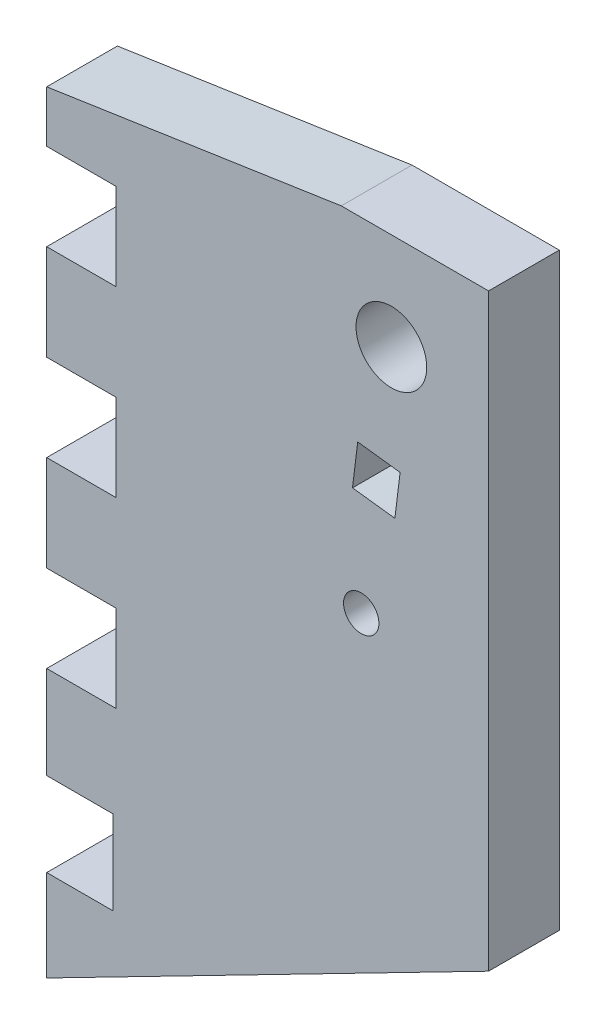
ISO-10303-21;
HEADER;
FILE_DESCRIPTION(('STEP AP214'),'2;1');
FILE_NAME('part.step','',(''),(''),'','','');
FILE_SCHEMA(('AUTOMOTIVE_DESIGN { 1 0 10303 214 1 1 1 1 }'));
ENDSEC;
DATA;
#1=APPLICATION_CONTEXT('core data for automotive mechanical design processes');
#2=APPLICATION_PROTOCOL_DEFINITION('international standard','automotive_design',2000,#1);
#3=PRODUCT_CONTEXT('',#1,'mechanical');
#4=PRODUCT('Part','Part','',(#3));
#5=PRODUCT_RELATED_PRODUCT_CATEGORY('part','',(#4));
#6=PRODUCT_DEFINITION_FORMATION('','',#4);
#7=PRODUCT_DEFINITION_CONTEXT('part definition',#1,'design');
#8=PRODUCT_DEFINITION('design','',#6,#7);
#9=PRODUCT_DEFINITION_SHAPE('','',#8);
#10=(LENGTH_UNIT() NAMED_UNIT(*) SI_UNIT(.MILLI.,.METRE.));
#11=(NAMED_UNIT(*) PLANE_ANGLE_UNIT() SI_UNIT($,.RADIAN.));
#12=(NAMED_UNIT(*) SI_UNIT($,.STERADIAN.) SOLID_ANGLE_UNIT());
#13=UNCERTAINTY_MEASURE_WITH_UNIT(LENGTH_MEASURE(1.E-05),#10,'distance_accuracy_value','');
#14=(GEOMETRIC_REPRESENTATION_CONTEXT(3) GLOBAL_UNCERTAINTY_ASSIGNED_CONTEXT((#13)) GLOBAL_UNIT_ASSIGNED_CONTEXT((#10,
#11,#12)) REPRESENTATION_CONTEXT('',''));
#15=CARTESIAN_POINT('',(0.,0.,0.));
#16=DIRECTION('',(0.,0.,1.));
#17=DIRECTION('',(1.,0.,0.));
#18=AXIS2_PLACEMENT_3D('',#15,#16,#17);
#19=CARTESIAN_POINT('',(-38.1,0.,6.096));
#20=DIRECTION('',(1.,0.,0.));
#21=DIRECTION('',(0.,0.,-1.));
#22=AXIS2_PLACEMENT_3D('',#19,#20,#21);
#23=PLANE('',#22);
#24=DIRECTION('',(0.,0.,1.));
#25=VECTOR('',#24,1.);
#26=CARTESIAN_POINT('',(-38.1,-62.484,0.));
#27=LINE('',#26,#25);
#28=CARTESIAN_POINT('',(-38.1,-62.484,0.));
#29=VERTEX_POINT('',#28);
#30=CARTESIAN_POINT('',(-38.1,-62.484,6.096));
#31=VERTEX_POINT('',#30);
#32=EDGE_CURVE('E264',#29,#31,#27,.T.);
#33=ORIENTED_EDGE('',*,*,#32,.F.);
#34=DIRECTION('',(0.,-1.,0.));
#35=VECTOR('',#34,1.);
#36=CARTESIAN_POINT('',(-38.1,0.,0.));
#37=LINE('',#36,#35);
#38=CARTESIAN_POINT('',(-38.1,-70.358,0.));
#39=VERTEX_POINT('',#38);
#40=EDGE_CURVE('E325',#29,#39,#37,.T.);
#41=ORIENTED_EDGE('',*,*,#40,.T.);
#42=DIRECTION('',(0.,0.,-1.));
#43=VECTOR('',#42,1.);
#44=CARTESIAN_POINT('',(-38.1,-70.358,6.096));
#45=LINE('',#44,#43);
#46=CARTESIAN_POINT('',(-38.1,-70.358,6.096));
#47=VERTEX_POINT('',#46);
#48=EDGE_CURVE('E11',#47,#39,#45,.T.);
#49=ORIENTED_EDGE('',*,*,#48,.F.);
#50=DIRECTION('',(0.,-1.,0.));
#51=VECTOR('',#50,1.);
#52=CARTESIAN_POINT('',(-38.1,0.,6.096));
#53=LINE('',#52,#51);
#54=EDGE_CURVE('E285',#31,#47,#53,.T.);
#55=ORIENTED_EDGE('',*,*,#54,.F.);
#56=EDGE_LOOP('',(#33,#41,#49,#55));
#57=FACE_BOUND('',#56,.T.);
#58=ADVANCED_FACE('F41',(#57),#23,.F.);
#59=DIRECTION('',(0.,0.,1.));
#60=VECTOR('',#59,1.);
#61=CARTESIAN_POINT('',(-38.1,-55.245,0.));
#62=LINE('',#61,#60);
#63=CARTESIAN_POINT('',(-38.1,-55.245,0.));
#64=VERTEX_POINT('',#63);
#65=CARTESIAN_POINT('',(-38.1,-55.245,6.096));
#66=VERTEX_POINT('',#65);
#67=EDGE_CURVE('E267',#64,#66,#62,.T.);
#68=ORIENTED_EDGE('',*,*,#67,.T.);
#69=CARTESIAN_POINT('',(-38.1,-47.244,6.096));
#70=VERTEX_POINT('',#69);
#71=EDGE_CURVE('E287',#70,#66,#53,.T.);
#72=ORIENTED_EDGE('',*,*,#71,.F.);
#73=DIRECTION('',(0.,0.,-1.));
#74=VECTOR('',#73,1.);
#75=CARTESIAN_POINT('',(-38.1,-47.244,6.096));
#76=LINE('',#75,#74);
#77=CARTESIAN_POINT('',(-38.1,-47.244,0.));
#78=VERTEX_POINT('',#77);
#79=EDGE_CURVE('E322',#70,#78,#76,.T.);
#80=ORIENTED_EDGE('',*,*,#79,.T.);
#81=EDGE_CURVE('E326',#78,#64,#37,.T.);
#82=ORIENTED_EDGE('',*,*,#81,.T.);
#83=EDGE_LOOP('',(#68,#72,#80,#82));
#84=FACE_BOUND('',#83,.T.);
#85=ADVANCED_FACE('F437',(#84),#23,.F.);
#86=CARTESIAN_POINT('',(0.,0.,6.096));
#87=DIRECTION('',(0.,0.,1.));
#88=DIRECTION('',(1.,0.,0.));
#89=AXIS2_PLACEMENT_3D('',#86,#87,#88);
#90=PLANE('',#89);
#91=CARTESIAN_POINT('',(-10.9822043108922,-29.5589646914192,6.096));
#92=DIRECTION('',(0.,0.,1.));
#93=DIRECTION('',(1.,0.,0.));
#94=AXIS2_PLACEMENT_3D('',#91,#92,#93);
#95=CIRCLE('',#94,1.524);
#96=CARTESIAN_POINT('',(-9.45820431089224,-29.5589646914192,6.096));
#97=VERTEX_POINT('',#96);
#98=EDGE_CURVE('E259',#97,#97,#95,.F.);
#99=ORIENTED_EDGE('',*,*,#98,.T.);
#100=EDGE_LOOP('',(#99));
#101=FACE_BOUND('',#100,.T.);
#102=DIRECTION('',(-0.992546151641322,0.121869343405148,0.));
#103=VECTOR('',#102,1.);
#104=CARTESIAN_POINT('',(-8.07875081307921,-21.0226784798377,6.096));
#105=LINE('',#104,#103);
#106=CARTESIAN_POINT('',(-8.07875081307921,-21.0226784798377,6.096));
#107=VERTEX_POINT('',#106);
#108=CARTESIAN_POINT('',(-11.7342982895742,-20.5738336880765,6.096));
#109=VERTEX_POINT('',#108);
#110=EDGE_CURVE('E222',#107,#109,#105,.T.);
#111=ORIENTED_EDGE('',*,*,#110,.T.);
#112=DIRECTION('',(0.121869343405149,0.992546151641322,0.));
#113=VECTOR('',#112,1.);
#114=CARTESIAN_POINT('',(-11.285453497813,-16.9182862115815,6.096));
#115=LINE('',#114,#113);
#116=CARTESIAN_POINT('',(-11.285453497813,-16.9182862115815,6.096));
#117=VERTEX_POINT('',#116);
#118=EDGE_CURVE('E209',#109,#117,#115,.T.);
#119=ORIENTED_EDGE('',*,*,#118,.T.);
#120=DIRECTION('',(0.992546151641322,-0.121869343405148,0.));
#121=VECTOR('',#120,1.);
#122=CARTESIAN_POINT('',(-7.62990602131805,-17.3671310033427,6.096));
#123=LINE('',#122,#121);
#124=CARTESIAN_POINT('',(-7.62990602131805,-17.3671310033427,6.096));
#125=VERTEX_POINT('',#124);
#126=EDGE_CURVE('E240',#117,#125,#123,.T.);
#127=ORIENTED_EDGE('',*,*,#126,.T.);
#128=DIRECTION('',(-0.121869343405148,-0.992546151641322,0.));
#129=VECTOR('',#128,1.);
#130=CARTESIAN_POINT('',(-7.62990602131805,-17.3671310033427,6.096));
#131=LINE('',#130,#129);
#132=EDGE_CURVE('E230',#125,#107,#131,.T.);
#133=ORIENTED_EDGE('',*,*,#132,.T.);
#134=EDGE_LOOP('',(#111,#119,#127,#133));
#135=FACE_BOUND('',#134,.T.);
#136=CARTESIAN_POINT('',(-8.382,-8.382,6.096));
#137=DIRECTION('',(0.,0.,1.));
#138=DIRECTION('',(1.,0.,0.));
#139=AXIS2_PLACEMENT_3D('',#136,#137,#138);
#140=CIRCLE('',#139,3.048);
#141=CARTESIAN_POINT('',(-11.43,-8.382,6.096));
#142=VERTEX_POINT('',#141);
#143=EDGE_CURVE('E282',#142,#142,#140,.T.);
#144=ORIENTED_EDGE('',*,*,#143,.F.);
#145=EDGE_LOOP('',(#144));
#146=FACE_BOUND('',#145,.T.);
#147=DIRECTION('',(0.,-1.,0.));
#148=VECTOR('',#147,1.);
#149=CARTESIAN_POINT('',(-32.385,0.,6.096));
#150=LINE('',#149,#148);
#151=CARTESIAN_POINT('',(-32.385,-55.245,6.096));
#152=VERTEX_POINT('',#151);
#153=CARTESIAN_POINT('',(-32.385,-62.484,6.096));
#154=VERTEX_POINT('',#153);
#155=EDGE_CURVE('E258',#152,#154,#150,.T.);
#156=ORIENTED_EDGE('',*,*,#155,.T.);
#157=DIRECTION('',(-1.,0.,0.));
#158=VECTOR('',#157,1.);
#159=CARTESIAN_POINT('',(0.,-62.484,6.096));
#160=LINE('',#159,#158);
#161=EDGE_CURVE('E255',#154,#31,#160,.T.);
#162=ORIENTED_EDGE('',*,*,#161,.T.);
#163=ORIENTED_EDGE('',*,*,#54,.T.);
#164=DIRECTION('',(0.889632145943001,0.456677834917407,0.));
#165=VECTOR('',#164,1.);
#166=CARTESIAN_POINT('',(20.6387843399346,-40.2054240388336,6.096));
#167=LINE('',#166,#165);
#168=CARTESIAN_POINT('',(0.,-50.8,6.096));
#169=VERTEX_POINT('',#168);
#170=EDGE_CURVE('E290',#47,#169,#167,.T.);
#171=ORIENTED_EDGE('',*,*,#170,.T.);
#172=DIRECTION('',(0.,-1.,0.));
#173=VECTOR('',#172,1.);
#174=CARTESIAN_POINT('',(0.,0.,6.096));
#175=LINE('',#174,#173);
#176=CARTESIAN_POINT('',(0.,0.,6.096));
#177=VERTEX_POINT('',#176);
#178=EDGE_CURVE('E292',#177,#169,#175,.T.);
#179=ORIENTED_EDGE('',*,*,#178,.F.);
#180=DIRECTION('',(-1.,0.,0.));
#181=VECTOR('',#180,1.);
#182=CARTESIAN_POINT('',(0.,0.,6.096));
#183=LINE('',#182,#181);
#184=CARTESIAN_POINT('',(-12.7,0.,6.096));
#185=VERTEX_POINT('',#184);
#186=EDGE_CURVE('E295',#177,#185,#183,.T.);
#187=ORIENTED_EDGE('',*,*,#186,.T.);
#188=DIRECTION('',(0.988936352868298,0.148340452930245,0.));
#189=VECTOR('',#188,1.);
#190=CARTESIAN_POINT('',(-0.279462102689486,1.86308068459657,6.096));
#191=LINE('',#190,#189);
#192=CARTESIAN_POINT('',(-38.1,-3.81,6.096));
#193=VERTEX_POINT('',#192);
#194=EDGE_CURVE('E278',#193,#185,#191,.T.);
#195=ORIENTED_EDGE('',*,*,#194,.F.);
#196=DIRECTION('',(0.,-1.,0.));
#197=VECTOR('',#196,1.);
#198=CARTESIAN_POINT('',(-38.1,0.,6.096));
#199=LINE('',#198,#197);
#200=CARTESIAN_POINT('',(-38.1,-8.25500000000001,6.096));
#201=VERTEX_POINT('',#200);
#202=EDGE_CURVE('E298',#193,#201,#199,.T.);
#203=ORIENTED_EDGE('',*,*,#202,.T.);
#204=DIRECTION('',(1.,0.,0.));
#205=VECTOR('',#204,1.);
#206=CARTESIAN_POINT('',(0.,-8.25500000000001,6.096));
#207=LINE('',#206,#205);
#208=CARTESIAN_POINT('',(-32.131,-8.25500000000001,6.096));
#209=VERTEX_POINT('',#208);
#210=EDGE_CURVE('E300',#201,#209,#207,.T.);
#211=ORIENTED_EDGE('',*,*,#210,.T.);
#212=DIRECTION('',(0.,-1.,0.));
#213=VECTOR('',#212,1.);
#214=CARTESIAN_POINT('',(-32.131,0.,6.096));
#215=LINE('',#214,#213);
#216=CARTESIAN_POINT('',(-32.131,-15.748,6.096));
#217=VERTEX_POINT('',#216);
#218=EDGE_CURVE('E302',#209,#217,#215,.T.);
#219=ORIENTED_EDGE('',*,*,#218,.T.);
#220=DIRECTION('',(-1.,0.,0.));
#221=VECTOR('',#220,1.);
#222=CARTESIAN_POINT('',(0.,-15.748,6.096));
#223=LINE('',#222,#221);
#224=CARTESIAN_POINT('',(-38.1,-15.748,6.096));
#225=VERTEX_POINT('',#224);
#226=EDGE_CURVE('E304',#217,#225,#223,.T.);
#227=ORIENTED_EDGE('',*,*,#226,.T.);
#228=DIRECTION('',(0.,-1.,0.));
#229=VECTOR('',#228,1.);
#230=CARTESIAN_POINT('',(-38.1,0.,6.096));
#231=LINE('',#230,#229);
#232=CARTESIAN_POINT('',(-38.1,-24.003,6.096));
#233=VERTEX_POINT('',#232);
#234=EDGE_CURVE('E306',#225,#233,#231,.T.);
#235=ORIENTED_EDGE('',*,*,#234,.T.);
#236=DIRECTION('',(1.,0.,0.));
#237=VECTOR('',#236,1.);
#238=CARTESIAN_POINT('',(0.,-24.003,6.096));
#239=LINE('',#238,#237);
#240=CARTESIAN_POINT('',(-32.131,-24.003,6.096));
#241=VERTEX_POINT('',#240);
#242=EDGE_CURVE('E308',#233,#241,#239,.T.);
#243=ORIENTED_EDGE('',*,*,#242,.T.);
#244=DIRECTION('',(0.,-1.,0.));
#245=VECTOR('',#244,1.);
#246=CARTESIAN_POINT('',(-32.131,0.,6.096));
#247=LINE('',#246,#245);
#248=CARTESIAN_POINT('',(-32.131,-31.496,6.096));
#249=VERTEX_POINT('',#248);
#250=EDGE_CURVE('E310',#241,#249,#247,.T.);
#251=ORIENTED_EDGE('',*,*,#250,.T.);
#252=DIRECTION('',(-1.,0.,0.));
#253=VECTOR('',#252,1.);
#254=CARTESIAN_POINT('',(0.,-31.496,6.096));
#255=LINE('',#254,#253);
#256=CARTESIAN_POINT('',(-38.1,-31.496,6.096));
#257=VERTEX_POINT('',#256);
#258=EDGE_CURVE('E312',#249,#257,#255,.T.);
#259=ORIENTED_EDGE('',*,*,#258,.T.);
#260=DIRECTION('',(0.,-1.,0.));
#261=VECTOR('',#260,1.);
#262=CARTESIAN_POINT('',(-38.1,0.,6.096));
#263=LINE('',#262,#261);
#264=CARTESIAN_POINT('',(-38.1,-39.751,6.096));
#265=VERTEX_POINT('',#264);
#266=EDGE_CURVE('E314',#257,#265,#263,.T.);
#267=ORIENTED_EDGE('',*,*,#266,.T.);
#268=DIRECTION('',(1.,0.,0.));
#269=VECTOR('',#268,1.);
#270=CARTESIAN_POINT('',(0.,-39.751,6.096));
#271=LINE('',#270,#269);
#272=CARTESIAN_POINT('',(-32.131,-39.751,6.096));
#273=VERTEX_POINT('',#272);
#274=EDGE_CURVE('E316',#265,#273,#271,.T.);
#275=ORIENTED_EDGE('',*,*,#274,.T.);
#276=DIRECTION('',(0.,-1.,0.));
#277=VECTOR('',#276,1.);
#278=CARTESIAN_POINT('',(-32.131,0.,6.096));
#279=LINE('',#278,#277);
#280=CARTESIAN_POINT('',(-32.131,-47.244,6.096));
#281=VERTEX_POINT('',#280);
#282=EDGE_CURVE('E318',#273,#281,#279,.T.);
#283=ORIENTED_EDGE('',*,*,#282,.T.);
#284=DIRECTION('',(-1.,0.,0.));
#285=VECTOR('',#284,1.);
#286=CARTESIAN_POINT('',(0.,-47.244,6.096));
#287=LINE('',#286,#285);
#288=EDGE_CURVE('E320',#281,#70,#287,.T.);
#289=ORIENTED_EDGE('',*,*,#288,.T.);
#290=ORIENTED_EDGE('',*,*,#71,.T.);
#291=DIRECTION('',(1.,0.,0.));
#292=VECTOR('',#291,1.);
#293=CARTESIAN_POINT('',(0.,-55.245,6.096));
#294=LINE('',#293,#292);
#295=EDGE_CURVE('E249',#66,#152,#294,.T.);
#296=ORIENTED_EDGE('',*,*,#295,.T.);
#297=EDGE_LOOP('',(#156,#162,#163,#171,#179,#187,#195,#203,#211,#219,#227,#235,#243,#251,#259,
#267,#275,#283,#289,#290,#296));
#298=FACE_BOUND('',#297,.T.);
#299=ADVANCED_FACE('F228',(#101,#135,#146,#298),#90,.T.);
#300=CARTESIAN_POINT('',(0.,0.,0.));
#301=DIRECTION('',(0.,0.,1.));
#302=DIRECTION('',(1.,0.,0.));
#303=AXIS2_PLACEMENT_3D('',#300,#301,#302);
#304=PLANE('',#303);
#305=CARTESIAN_POINT('',(-10.9822043108922,-29.5589646914192,0.));
#306=DIRECTION('',(0.,0.,-1.));
#307=DIRECTION('',(-1.,0.,0.));
#308=AXIS2_PLACEMENT_3D('',#305,#306,#307);
#309=CIRCLE('',#308,1.524);
#310=CARTESIAN_POINT('',(-12.5062043108922,-29.5589646914192,0.));
#311=VERTEX_POINT('',#310);
#312=EDGE_CURVE('E245',#311,#311,#309,.T.);
#313=ORIENTED_EDGE('',*,*,#312,.F.);
#314=EDGE_LOOP('',(#313));
#315=FACE_BOUND('',#314,.T.);
#316=DIRECTION('',(0.121869343405149,0.992546151641322,0.));
#317=VECTOR('',#316,1.);
#318=CARTESIAN_POINT('',(-11.285453497813,-16.9182862115815,0.));
#319=LINE('',#318,#317);
#320=CARTESIAN_POINT('',(-11.7342982895742,-20.5738336880765,0.));
#321=VERTEX_POINT('',#320);
#322=CARTESIAN_POINT('',(-11.285453497813,-16.9182862115815,0.));
#323=VERTEX_POINT('',#322);
#324=EDGE_CURVE('E232',#321,#323,#319,.T.);
#325=ORIENTED_EDGE('',*,*,#324,.F.);
#326=DIRECTION('',(-0.992546151641322,0.121869343405148,0.));
#327=VECTOR('',#326,1.);
#328=CARTESIAN_POINT('',(-8.07875081307921,-21.0226784798377,0.));
#329=LINE('',#328,#327);
#330=CARTESIAN_POINT('',(-8.07875081307921,-21.0226784798377,0.));
#331=VERTEX_POINT('',#330);
#332=EDGE_CURVE('E225',#331,#321,#329,.T.);
#333=ORIENTED_EDGE('',*,*,#332,.F.);
#334=DIRECTION('',(-0.121869343405148,-0.992546151641322,0.));
#335=VECTOR('',#334,1.);
#336=CARTESIAN_POINT('',(-7.62990602131805,-17.3671310033427,0.));
#337=LINE('',#336,#335);
#338=CARTESIAN_POINT('',(-7.62990602131805,-17.3671310033427,0.));
#339=VERTEX_POINT('',#338);
#340=EDGE_CURVE('E236',#339,#331,#337,.T.);
#341=ORIENTED_EDGE('',*,*,#340,.F.);
#342=DIRECTION('',(0.992546151641322,-0.121869343405148,0.));
#343=VECTOR('',#342,1.);
#344=CARTESIAN_POINT('',(-7.62990602131805,-17.3671310033427,0.));
#345=LINE('',#344,#343);
#346=EDGE_CURVE('E64',#323,#339,#345,.T.);
#347=ORIENTED_EDGE('',*,*,#346,.F.);
#348=EDGE_LOOP('',(#325,#333,#341,#347));
#349=FACE_BOUND('',#348,.T.);
#350=CARTESIAN_POINT('',(-8.382,-8.382,0.));
#351=DIRECTION('',(0.,0.,1.));
#352=DIRECTION('',(1.,0.,0.));
#353=AXIS2_PLACEMENT_3D('',#350,#351,#352);
#354=CIRCLE('',#353,3.048);
#355=CARTESIAN_POINT('',(-11.43,-8.382,0.));
#356=VERTEX_POINT('',#355);
#357=EDGE_CURVE('E281',#356,#356,#354,.T.);
#358=ORIENTED_EDGE('',*,*,#357,.T.);
#359=EDGE_LOOP('',(#358));
#360=FACE_BOUND('',#359,.T.);
#361=DIRECTION('',(-1.,0.,0.));
#362=VECTOR('',#361,1.);
#363=CARTESIAN_POINT('',(0.,-62.484,0.));
#364=LINE('',#363,#362);
#365=CARTESIAN_POINT('',(-32.385,-62.484,0.));
#366=VERTEX_POINT('',#365);
#367=EDGE_CURVE('E246',#366,#29,#364,.T.);
#368=ORIENTED_EDGE('',*,*,#367,.F.);
#369=DIRECTION('',(0.,-1.,0.));
#370=VECTOR('',#369,1.);
#371=CARTESIAN_POINT('',(-32.385,0.,0.));
#372=LINE('',#371,#370);
#373=CARTESIAN_POINT('',(-32.385,-55.245,0.));
#374=VERTEX_POINT('',#373);
#375=EDGE_CURVE('E248',#374,#366,#372,.T.);
#376=ORIENTED_EDGE('',*,*,#375,.F.);
#377=DIRECTION('',(1.,0.,0.));
#378=VECTOR('',#377,1.);
#379=CARTESIAN_POINT('',(0.,-55.245,0.));
#380=LINE('',#379,#378);
#381=EDGE_CURVE('E251',#64,#374,#380,.T.);
#382=ORIENTED_EDGE('',*,*,#381,.F.);
#383=ORIENTED_EDGE('',*,*,#81,.F.);
#384=DIRECTION('',(-1.,0.,0.));
#385=VECTOR('',#384,1.);
#386=CARTESIAN_POINT('',(0.,-47.244,0.));
#387=LINE('',#386,#385);
#388=CARTESIAN_POINT('',(-32.131,-47.244,0.));
#389=VERTEX_POINT('',#388);
#390=EDGE_CURVE('E286',#389,#78,#387,.T.);
#391=ORIENTED_EDGE('',*,*,#390,.F.);
#392=DIRECTION('',(0.,-1.,0.));
#393=VECTOR('',#392,1.);
#394=CARTESIAN_POINT('',(-32.131,0.,0.));
#395=LINE('',#394,#393);
#396=CARTESIAN_POINT('',(-32.131,-39.751,0.));
#397=VERTEX_POINT('',#396);
#398=EDGE_CURVE('E358',#397,#389,#395,.T.);
#399=ORIENTED_EDGE('',*,*,#398,.F.);
#400=DIRECTION('',(1.,0.,0.));
#401=VECTOR('',#400,1.);
#402=CARTESIAN_POINT('',(0.,-39.751,0.));
#403=LINE('',#402,#401);
#404=CARTESIAN_POINT('',(-38.1,-39.751,0.));
#405=VERTEX_POINT('',#404);
#406=EDGE_CURVE('E356',#405,#397,#403,.T.);
#407=ORIENTED_EDGE('',*,*,#406,.F.);
#408=DIRECTION('',(0.,-1.,0.));
#409=VECTOR('',#408,1.);
#410=CARTESIAN_POINT('',(-38.1,0.,0.));
#411=LINE('',#410,#409);
#412=CARTESIAN_POINT('',(-38.1,-31.496,0.));
#413=VERTEX_POINT('',#412);
#414=EDGE_CURVE('E354',#413,#405,#411,.T.);
#415=ORIENTED_EDGE('',*,*,#414,.F.);
#416=DIRECTION('',(-1.,0.,0.));
#417=VECTOR('',#416,1.);
#418=CARTESIAN_POINT('',(0.,-31.496,0.));
#419=LINE('',#418,#417);
#420=CARTESIAN_POINT('',(-32.131,-31.496,0.));
#421=VERTEX_POINT('',#420);
#422=EDGE_CURVE('E352',#421,#413,#419,.T.);
#423=ORIENTED_EDGE('',*,*,#422,.F.);
#424=DIRECTION('',(0.,-1.,0.));
#425=VECTOR('',#424,1.);
#426=CARTESIAN_POINT('',(-32.131,0.,0.));
#427=LINE('',#426,#425);
#428=CARTESIAN_POINT('',(-32.131,-24.003,0.));
#429=VERTEX_POINT('',#428);
#430=EDGE_CURVE('E350',#429,#421,#427,.T.);
#431=ORIENTED_EDGE('',*,*,#430,.F.);
#432=DIRECTION('',(1.,0.,0.));
#433=VECTOR('',#432,1.);
#434=CARTESIAN_POINT('',(0.,-24.003,0.));
#435=LINE('',#434,#433);
#436=CARTESIAN_POINT('',(-38.1,-24.003,0.));
#437=VERTEX_POINT('',#436);
#438=EDGE_CURVE('E348',#437,#429,#435,.T.);
#439=ORIENTED_EDGE('',*,*,#438,.F.);
#440=DIRECTION('',(0.,-1.,0.));
#441=VECTOR('',#440,1.);
#442=CARTESIAN_POINT('',(-38.1,0.,0.));
#443=LINE('',#442,#441);
#444=CARTESIAN_POINT('',(-38.1,-15.748,0.));
#445=VERTEX_POINT('',#444);
#446=EDGE_CURVE('E346',#445,#437,#443,.T.);
#447=ORIENTED_EDGE('',*,*,#446,.F.);
#448=DIRECTION('',(-1.,0.,0.));
#449=VECTOR('',#448,1.);
#450=CARTESIAN_POINT('',(0.,-15.748,0.));
#451=LINE('',#450,#449);
#452=CARTESIAN_POINT('',(-32.131,-15.748,0.));
#453=VERTEX_POINT('',#452);
#454=EDGE_CURVE('E344',#453,#445,#451,.T.);
#455=ORIENTED_EDGE('',*,*,#454,.F.);
#456=DIRECTION('',(0.,-1.,0.));
#457=VECTOR('',#456,1.);
#458=CARTESIAN_POINT('',(-32.131,0.,0.));
#459=LINE('',#458,#457);
#460=CARTESIAN_POINT('',(-32.131,-8.25500000000001,0.));
#461=VERTEX_POINT('',#460);
#462=EDGE_CURVE('E342',#461,#453,#459,.T.);
#463=ORIENTED_EDGE('',*,*,#462,.F.);
#464=DIRECTION('',(1.,0.,0.));
#465=VECTOR('',#464,1.);
#466=CARTESIAN_POINT('',(0.,-8.25500000000001,0.));
#467=LINE('',#466,#465);
#468=CARTESIAN_POINT('',(-38.1,-8.25500000000001,0.));
#469=VERTEX_POINT('',#468);
#470=EDGE_CURVE('E340',#469,#461,#467,.T.);
#471=ORIENTED_EDGE('',*,*,#470,.F.);
#472=DIRECTION('',(0.,-1.,0.));
#473=VECTOR('',#472,1.);
#474=CARTESIAN_POINT('',(-38.1,0.,0.));
#475=LINE('',#474,#473);
#476=CARTESIAN_POINT('',(-38.1,-3.81,0.));
#477=VERTEX_POINT('',#476);
#478=EDGE_CURVE('E338',#477,#469,#475,.T.);
#479=ORIENTED_EDGE('',*,*,#478,.F.);
#480=DIRECTION('',(-0.988936352868298,-0.148340452930245,0.));
#481=VECTOR('',#480,1.);
#482=CARTESIAN_POINT('',(-12.7,0.,0.));
#483=LINE('',#482,#481);
#484=CARTESIAN_POINT('',(-12.7,0.,0.));
#485=VERTEX_POINT('',#484);
#486=EDGE_CURVE('E266',#485,#477,#483,.T.);
#487=ORIENTED_EDGE('',*,*,#486,.F.);
#488=DIRECTION('',(-1.,0.,0.));
#489=VECTOR('',#488,1.);
#490=CARTESIAN_POINT('',(0.,0.,0.));
#491=LINE('',#490,#489);
#492=CARTESIAN_POINT('',(0.,0.,0.));
#493=VERTEX_POINT('',#492);
#494=EDGE_CURVE('E335',#493,#485,#491,.T.);
#495=ORIENTED_EDGE('',*,*,#494,.F.);
#496=DIRECTION('',(0.,-1.,0.));
#497=VECTOR('',#496,1.);
#498=CARTESIAN_POINT('',(0.,0.,0.));
#499=LINE('',#498,#497);
#500=CARTESIAN_POINT('',(0.,-50.8,0.));
#501=VERTEX_POINT('',#500);
#502=EDGE_CURVE('E332',#493,#501,#499,.T.);
#503=ORIENTED_EDGE('',*,*,#502,.T.);
#504=DIRECTION('',(0.889632145943001,0.456677834917407,0.));
#505=VECTOR('',#504,1.);
#506=CARTESIAN_POINT('',(20.6387843399346,-40.2054240388336,0.));
#507=LINE('',#506,#505);
#508=EDGE_CURVE('E329',#39,#501,#507,.T.);
#509=ORIENTED_EDGE('',*,*,#508,.F.);
#510=ORIENTED_EDGE('',*,*,#40,.F.);
#511=EDGE_LOOP('',(#368,#376,#382,#383,#391,#399,#407,#415,#423,#431,#439,#447,#455,#463,#471,
#479,#487,#495,#503,#509,#510));
#512=FACE_BOUND('',#511,.T.);
#513=ADVANCED_FACE('F411',(#315,#349,#360,#512),#304,.F.);
#514=CARTESIAN_POINT('',(20.6387843399346,-40.2054240388336,6.096));
#515=DIRECTION('',(-0.456677834917407,0.889632145943001,0.));
#516=DIRECTION('',(-0.889632145943001,-0.456677834917407,0.));
#517=AXIS2_PLACEMENT_3D('',#514,#515,#516);
#518=PLANE('',#517);
#519=ORIENTED_EDGE('',*,*,#508,.T.);
#520=DIRECTION('',(0.,0.,-1.));
#521=VECTOR('',#520,1.);
#522=CARTESIAN_POINT('',(0.,-50.8,6.096));
#523=LINE('',#522,#521);
#524=EDGE_CURVE('E49',#169,#501,#523,.T.);
#525=ORIENTED_EDGE('',*,*,#524,.F.);
#526=ORIENTED_EDGE('',*,*,#170,.F.);
#527=ORIENTED_EDGE('',*,*,#48,.T.);
#528=EDGE_LOOP('',(#519,#525,#526,#527));
#529=FACE_BOUND('',#528,.T.);
#530=ADVANCED_FACE('F405',(#529),#518,.F.);
#531=CARTESIAN_POINT('',(0.,0.,6.096));
#532=DIRECTION('',(1.,0.,0.));
#533=DIRECTION('',(0.,1.,0.));
#534=AXIS2_PLACEMENT_3D('',#531,#532,#533);
#535=PLANE('',#534);
#536=ORIENTED_EDGE('',*,*,#502,.F.);
#537=DIRECTION('',(0.,0.,-1.));
#538=VECTOR('',#537,1.);
#539=CARTESIAN_POINT('',(0.,0.,6.096));
#540=LINE('',#539,#538);
#541=EDGE_CURVE('E396',#177,#493,#540,.T.);
#542=ORIENTED_EDGE('',*,*,#541,.F.);
#543=ORIENTED_EDGE('',*,*,#178,.T.);
#544=ORIENTED_EDGE('',*,*,#524,.T.);
#545=EDGE_LOOP('',(#536,#542,#543,#544));
#546=FACE_BOUND('',#545,.T.);
#547=ADVANCED_FACE('F400',(#546),#535,.T.);
#548=CARTESIAN_POINT('',(0.,0.,6.096));
#549=DIRECTION('',(0.,-1.,0.));
#550=DIRECTION('',(0.,0.,-1.));
#551=AXIS2_PLACEMENT_3D('',#548,#549,#550);
#552=PLANE('',#551);
#553=ORIENTED_EDGE('',*,*,#494,.T.);
#554=DIRECTION('',(0.,0.,-1.));
#555=VECTOR('',#554,1.);
#556=CARTESIAN_POINT('',(-12.7,0.,8.636));
#557=LINE('',#556,#555);
#558=EDGE_CURVE('E274',#185,#485,#557,.T.);
#559=ORIENTED_EDGE('',*,*,#558,.F.);
#560=ORIENTED_EDGE('',*,*,#186,.F.);
#561=ORIENTED_EDGE('',*,*,#541,.T.);
#562=EDGE_LOOP('',(#553,#559,#560,#561));
#563=FACE_BOUND('',#562,.T.);
#564=ADVANCED_FACE('F416',(#563),#552,.F.);
#565=CARTESIAN_POINT('',(-38.1,0.,6.096));
#566=DIRECTION('',(1.,0.,0.));
#567=DIRECTION('',(0.,0.,-1.));
#568=AXIS2_PLACEMENT_3D('',#565,#566,#567);
#569=PLANE('',#568);
#570=ORIENTED_EDGE('',*,*,#202,.F.);
#571=DIRECTION('',(0.,0.,-1.));
#572=VECTOR('',#571,1.);
#573=CARTESIAN_POINT('',(-38.1,-3.81,8.636));
#574=LINE('',#573,#572);
#575=EDGE_CURVE('E275',#193,#477,#574,.T.);
#576=ORIENTED_EDGE('',*,*,#575,.T.);
#577=ORIENTED_EDGE('',*,*,#478,.T.);
#578=DIRECTION('',(0.,0.,-1.));
#579=VECTOR('',#578,1.);
#580=CARTESIAN_POINT('',(-38.1,-8.25500000000001,6.096));
#581=LINE('',#580,#579);
#582=EDGE_CURVE('E393',#201,#469,#581,.T.);
#583=ORIENTED_EDGE('',*,*,#582,.F.);
#584=EDGE_LOOP('',(#570,#576,#577,#583));
#585=FACE_BOUND('',#584,.T.);
#586=ADVANCED_FACE('F496',(#585),#569,.F.);
#587=CARTESIAN_POINT('',(0.,-8.25500000000001,6.096));
#588=DIRECTION('',(0.,1.,0.));
#589=DIRECTION('',(0.,0.,1.));
#590=AXIS2_PLACEMENT_3D('',#587,#588,#589);
#591=PLANE('',#590);
#592=ORIENTED_EDGE('',*,*,#470,.T.);
#593=DIRECTION('',(0.,0.,-1.));
#594=VECTOR('',#593,1.);
#595=CARTESIAN_POINT('',(-32.131,-8.25500000000001,6.096));
#596=LINE('',#595,#594);
#597=EDGE_CURVE('E390',#209,#461,#596,.T.);
#598=ORIENTED_EDGE('',*,*,#597,.F.);
#599=ORIENTED_EDGE('',*,*,#210,.F.);
#600=ORIENTED_EDGE('',*,*,#582,.T.);
#601=EDGE_LOOP('',(#592,#598,#599,#600));
#602=FACE_BOUND('',#601,.T.);
#603=ADVANCED_FACE('F491',(#602),#591,.F.);
#604=CARTESIAN_POINT('',(-32.131,0.,6.096));
#605=DIRECTION('',(1.,0.,0.));
#606=DIRECTION('',(0.,0.,-1.));
#607=AXIS2_PLACEMENT_3D('',#604,#605,#606);
#608=PLANE('',#607);
#609=ORIENTED_EDGE('',*,*,#462,.T.);
#610=DIRECTION('',(0.,0.,-1.));
#611=VECTOR('',#610,1.);
#612=CARTESIAN_POINT('',(-32.131,-15.748,6.096));
#613=LINE('',#612,#611);
#614=EDGE_CURVE('E387',#217,#453,#613,.T.);
#615=ORIENTED_EDGE('',*,*,#614,.F.);
#616=ORIENTED_EDGE('',*,*,#218,.F.);
#617=ORIENTED_EDGE('',*,*,#597,.T.);
#618=EDGE_LOOP('',(#609,#615,#616,#617));
#619=FACE_BOUND('',#618,.T.);
#620=ADVANCED_FACE('F487',(#619),#608,.F.);
#621=CARTESIAN_POINT('',(0.,-15.748,6.096));
#622=DIRECTION('',(0.,-1.,0.));
#623=DIRECTION('',(0.,0.,-1.));
#624=AXIS2_PLACEMENT_3D('',#621,#622,#623);
#625=PLANE('',#624);
#626=ORIENTED_EDGE('',*,*,#454,.T.);
#627=DIRECTION('',(0.,0.,-1.));
#628=VECTOR('',#627,1.);
#629=CARTESIAN_POINT('',(-38.1,-15.748,6.096));
#630=LINE('',#629,#628);
#631=EDGE_CURVE('E384',#225,#445,#630,.T.);
#632=ORIENTED_EDGE('',*,*,#631,.F.);
#633=ORIENTED_EDGE('',*,*,#226,.F.);
#634=ORIENTED_EDGE('',*,*,#614,.T.);
#635=EDGE_LOOP('',(#626,#632,#633,#634));
#636=FACE_BOUND('',#635,.T.);
#637=ADVANCED_FACE('F483',(#636),#625,.F.);
#638=CARTESIAN_POINT('',(-38.1,0.,6.096));
#639=DIRECTION('',(1.,0.,0.));
#640=DIRECTION('',(0.,0.,-1.));
#641=AXIS2_PLACEMENT_3D('',#638,#639,#640);
#642=PLANE('',#641);
#643=ORIENTED_EDGE('',*,*,#446,.T.);
#644=DIRECTION('',(0.,0.,-1.));
#645=VECTOR('',#644,1.);
#646=CARTESIAN_POINT('',(-38.1,-24.003,6.096));
#647=LINE('',#646,#645);
#648=EDGE_CURVE('E381',#233,#437,#647,.T.);
#649=ORIENTED_EDGE('',*,*,#648,.F.);
#650=ORIENTED_EDGE('',*,*,#234,.F.);
#651=ORIENTED_EDGE('',*,*,#631,.T.);
#652=EDGE_LOOP('',(#643,#649,#650,#651));
#653=FACE_BOUND('',#652,.T.);
#654=ADVANCED_FACE('F478',(#653),#642,.F.);
#655=CARTESIAN_POINT('',(0.,-24.003,6.096));
#656=DIRECTION('',(0.,1.,0.));
#657=DIRECTION('',(0.,0.,1.));
#658=AXIS2_PLACEMENT_3D('',#655,#656,#657);
#659=PLANE('',#658);
#660=ORIENTED_EDGE('',*,*,#438,.T.);
#661=DIRECTION('',(0.,0.,-1.));
#662=VECTOR('',#661,1.);
#663=CARTESIAN_POINT('',(-32.131,-24.003,6.096));
#664=LINE('',#663,#662);
#665=EDGE_CURVE('E378',#241,#429,#664,.T.);
#666=ORIENTED_EDGE('',*,*,#665,.F.);
#667=ORIENTED_EDGE('',*,*,#242,.F.);
#668=ORIENTED_EDGE('',*,*,#648,.T.);
#669=EDGE_LOOP('',(#660,#666,#667,#668));
#670=FACE_BOUND('',#669,.T.);
#671=ADVANCED_FACE('F472',(#670),#659,.F.);
#672=CARTESIAN_POINT('',(-32.131,0.,6.096));
#673=DIRECTION('',(1.,0.,0.));
#674=DIRECTION('',(0.,0.,-1.));
#675=AXIS2_PLACEMENT_3D('',#672,#673,#674);
#676=PLANE('',#675);
#677=ORIENTED_EDGE('',*,*,#430,.T.);
#678=DIRECTION('',(0.,0.,-1.));
#679=VECTOR('',#678,1.);
#680=CARTESIAN_POINT('',(-32.131,-31.496,6.096));
#681=LINE('',#680,#679);
#682=EDGE_CURVE('E375',#249,#421,#681,.T.);
#683=ORIENTED_EDGE('',*,*,#682,.F.);
#684=ORIENTED_EDGE('',*,*,#250,.F.);
#685=ORIENTED_EDGE('',*,*,#665,.T.);
#686=EDGE_LOOP('',(#677,#683,#684,#685));
#687=FACE_BOUND('',#686,.T.);
#688=ADVANCED_FACE('F468',(#687),#676,.F.);
#689=CARTESIAN_POINT('',(0.,-31.496,6.096));
#690=DIRECTION('',(0.,-1.,0.));
#691=DIRECTION('',(1.,0.,0.));
#692=AXIS2_PLACEMENT_3D('',#689,#690,#691);
#693=PLANE('',#692);
#694=ORIENTED_EDGE('',*,*,#422,.T.);
#695=DIRECTION('',(0.,0.,-1.));
#696=VECTOR('',#695,1.);
#697=CARTESIAN_POINT('',(-38.1,-31.496,6.096));
#698=LINE('',#697,#696);
#699=EDGE_CURVE('E372',#257,#413,#698,.T.);
#700=ORIENTED_EDGE('',*,*,#699,.F.);
#701=ORIENTED_EDGE('',*,*,#258,.F.);
#702=ORIENTED_EDGE('',*,*,#682,.T.);
#703=EDGE_LOOP('',(#694,#700,#701,#702));
#704=FACE_BOUND('',#703,.T.);
#705=ADVANCED_FACE('F463',(#704),#693,.F.);
#706=CARTESIAN_POINT('',(-38.1,0.,6.096));
#707=DIRECTION('',(1.,0.,0.));
#708=DIRECTION('',(0.,0.,-1.));
#709=AXIS2_PLACEMENT_3D('',#706,#707,#708);
#710=PLANE('',#709);
#711=ORIENTED_EDGE('',*,*,#414,.T.);
#712=DIRECTION('',(0.,0.,-1.));
#713=VECTOR('',#712,1.);
#714=CARTESIAN_POINT('',(-38.1,-39.751,6.096));
#715=LINE('',#714,#713);
#716=EDGE_CURVE('E369',#265,#405,#715,.T.);
#717=ORIENTED_EDGE('',*,*,#716,.F.);
#718=ORIENTED_EDGE('',*,*,#266,.F.);
#719=ORIENTED_EDGE('',*,*,#699,.T.);
#720=EDGE_LOOP('',(#711,#717,#718,#719));
#721=FACE_BOUND('',#720,.T.);
#722=ADVANCED_FACE('F457',(#721),#710,.F.);
#723=CARTESIAN_POINT('',(0.,-39.751,6.096));
#724=DIRECTION('',(0.,1.,0.));
#725=DIRECTION('',(0.,0.,1.));
#726=AXIS2_PLACEMENT_3D('',#723,#724,#725);
#727=PLANE('',#726);
#728=ORIENTED_EDGE('',*,*,#406,.T.);
#729=DIRECTION('',(0.,0.,-1.));
#730=VECTOR('',#729,1.);
#731=CARTESIAN_POINT('',(-32.131,-39.751,6.096));
#732=LINE('',#731,#730);
#733=EDGE_CURVE('E366',#273,#397,#732,.T.);
#734=ORIENTED_EDGE('',*,*,#733,.F.);
#735=ORIENTED_EDGE('',*,*,#274,.F.);
#736=ORIENTED_EDGE('',*,*,#716,.T.);
#737=EDGE_LOOP('',(#728,#734,#735,#736));
#738=FACE_BOUND('',#737,.T.);
#739=ADVANCED_FACE('F453',(#738),#727,.F.);
#740=CARTESIAN_POINT('',(-32.131,0.,6.096));
#741=DIRECTION('',(1.,0.,0.));
#742=DIRECTION('',(0.,0.,-1.));
#743=AXIS2_PLACEMENT_3D('',#740,#741,#742);
#744=PLANE('',#743);
#745=ORIENTED_EDGE('',*,*,#398,.T.);
#746=DIRECTION('',(0.,0.,-1.));
#747=VECTOR('',#746,1.);
#748=CARTESIAN_POINT('',(-32.131,-47.244,6.096));
#749=LINE('',#748,#747);
#750=EDGE_CURVE('E363',#281,#389,#749,.T.);
#751=ORIENTED_EDGE('',*,*,#750,.F.);
#752=ORIENTED_EDGE('',*,*,#282,.F.);
#753=ORIENTED_EDGE('',*,*,#733,.T.);
#754=EDGE_LOOP('',(#745,#751,#752,#753));
#755=FACE_BOUND('',#754,.T.);
#756=ADVANCED_FACE('F448',(#755),#744,.F.);
#757=CARTESIAN_POINT('',(-8.382,-8.382,6.096));
#758=DIRECTION('',(0.,0.,-1.));
#759=DIRECTION('',(-1.,0.,0.));
#760=AXIS2_PLACEMENT_3D('',#757,#758,#759);
#761=CYLINDRICAL_SURFACE('',#760,3.048);
#762=CARTESIAN_POINT('',(-11.43,-8.382,6.096));
#763=CARTESIAN_POINT('',(-11.43,-8.382,6.0325));
#764=CARTESIAN_POINT('',(-11.43,-8.382,5.969));
#765=CARTESIAN_POINT('',(-11.43,-8.382,5.842));
#766=CARTESIAN_POINT('',(-11.43,-8.382,5.7785));
#767=CARTESIAN_POINT('',(-11.43,-8.382,5.6515));
#768=CARTESIAN_POINT('',(-11.43,-8.382,5.588));
#769=CARTESIAN_POINT('',(-11.43,-8.382,5.461));
#770=CARTESIAN_POINT('',(-11.43,-8.382,5.3975));
#771=CARTESIAN_POINT('',(-11.43,-8.382,5.2705));
#772=CARTESIAN_POINT('',(-11.43,-8.382,5.207));
#773=CARTESIAN_POINT('',(-11.43,-8.382,5.08));
#774=CARTESIAN_POINT('',(-11.43,-8.382,5.0165));
#775=CARTESIAN_POINT('',(-11.43,-8.382,4.8895));
#776=CARTESIAN_POINT('',(-11.43,-8.382,4.826));
#777=CARTESIAN_POINT('',(-11.43,-8.382,4.699));
#778=CARTESIAN_POINT('',(-11.43,-8.382,4.6355));
#779=CARTESIAN_POINT('',(-11.43,-8.382,4.5085));
#780=CARTESIAN_POINT('',(-11.43,-8.382,4.445));
#781=CARTESIAN_POINT('',(-11.43,-8.382,4.318));
#782=CARTESIAN_POINT('',(-11.43,-8.382,4.2545));
#783=CARTESIAN_POINT('',(-11.43,-8.382,4.1275));
#784=CARTESIAN_POINT('',(-11.43,-8.382,4.064));
#785=CARTESIAN_POINT('',(-11.43,-8.382,3.937));
#786=CARTESIAN_POINT('',(-11.43,-8.382,3.8735));
#787=CARTESIAN_POINT('',(-11.43,-8.382,3.7465));
#788=CARTESIAN_POINT('',(-11.43,-8.382,3.683));
#789=CARTESIAN_POINT('',(-11.43,-8.382,3.556));
#790=CARTESIAN_POINT('',(-11.43,-8.382,3.4925));
#791=CARTESIAN_POINT('',(-11.43,-8.382,3.3655));
#792=CARTESIAN_POINT('',(-11.43,-8.382,3.302));
#793=CARTESIAN_POINT('',(-11.43,-8.382,3.175));
#794=CARTESIAN_POINT('',(-11.43,-8.382,3.1115));
#795=CARTESIAN_POINT('',(-11.43,-8.382,2.9845));
#796=CARTESIAN_POINT('',(-11.43,-8.382,2.921));
#797=CARTESIAN_POINT('',(-11.43,-8.382,2.794));
#798=CARTESIAN_POINT('',(-11.43,-8.382,2.7305));
#799=CARTESIAN_POINT('',(-11.43,-8.382,2.6035));
#800=CARTESIAN_POINT('',(-11.43,-8.382,2.54));
#801=CARTESIAN_POINT('',(-11.43,-8.382,2.413));
#802=CARTESIAN_POINT('',(-11.43,-8.382,2.3495));
#803=CARTESIAN_POINT('',(-11.43,-8.382,2.2225));
#804=CARTESIAN_POINT('',(-11.43,-8.382,2.159));
#805=CARTESIAN_POINT('',(-11.43,-8.382,2.032));
#806=CARTESIAN_POINT('',(-11.43,-8.382,1.9685));
#807=CARTESIAN_POINT('',(-11.43,-8.382,1.8415));
#808=CARTESIAN_POINT('',(-11.43,-8.382,1.778));
#809=CARTESIAN_POINT('',(-11.43,-8.382,1.651));
#810=CARTESIAN_POINT('',(-11.43,-8.382,1.5875));
#811=CARTESIAN_POINT('',(-11.43,-8.382,1.4605));
#812=CARTESIAN_POINT('',(-11.43,-8.382,1.397));
#813=CARTESIAN_POINT('',(-11.43,-8.382,1.27));
#814=CARTESIAN_POINT('',(-11.43,-8.382,1.2065));
#815=CARTESIAN_POINT('',(-11.43,-8.382,1.0795));
#816=CARTESIAN_POINT('',(-11.43,-8.382,1.016));
#817=CARTESIAN_POINT('',(-11.43,-8.382,0.889));
#818=CARTESIAN_POINT('',(-11.43,-8.382,0.8255));
#819=CARTESIAN_POINT('',(-11.43,-8.382,0.6985));
#820=CARTESIAN_POINT('',(-11.43,-8.382,0.635));
#821=CARTESIAN_POINT('',(-11.43,-8.382,0.508));
#822=CARTESIAN_POINT('',(-11.43,-8.382,0.4445));
#823=CARTESIAN_POINT('',(-11.43,-8.382,0.3175));
#824=CARTESIAN_POINT('',(-11.43,-8.382,0.254));
#825=CARTESIAN_POINT('',(-11.43,-8.382,0.127));
#826=CARTESIAN_POINT('',(-11.43,-8.382,0.0634999999999999));
#827=CARTESIAN_POINT('',(-11.43,-8.382,0.));
#828=B_SPLINE_CURVE_WITH_KNOTS('',3,(#762,#763,#764,#765,#766,#767,#768,#769,#770,#771,#772,
#773,#774,#775,#776,#777,#778,#779,#780,#781,#782,#783,#784,#785,#786,#787,#788,#789,#790,#791,
#792,#793,#794,#795,#796,#797,#798,#799,#800,#801,#802,#803,#804,#805,#806,#807,#808,#809,#810,
#811,#812,#813,#814,#815,#816,#817,#818,#819,#820,#821,#822,#823,#824,#825,#826,#827),
.UNSPECIFIED.,.F.,.F.,(4,2,2,2,2,2,2,2,2,2,2,2,2,2,2,2,2,2,2,2,2,2,2,2,2,2,2,2,2,2,2,2,4),(0.,
0.1905,0.380999999999999,0.571499999999999,0.762,0.952499999999999,1.143,1.3335,1.524,1.7145,
1.905,2.0955,2.286,2.4765,2.667,2.8575,3.048,3.2385,3.429,3.6195,3.81,4.0005,4.191,4.3815,4.572,
4.7625,4.953,5.1435,5.334,5.5245,5.715,5.9055,6.096),.UNSPECIFIED.);
#829=EDGE_CURVE('BSEAM43',#142,#356,#828,.T.);
#830=ORIENTED_EDGE('',*,*,#143,.T.);
#831=ORIENTED_EDGE('',*,*,#357,.F.);
#832=ORIENTED_EDGE('',*,*,#829,.T.);
#833=ORIENTED_EDGE('',*,*,#829,.F.);
#834=EDGE_LOOP('',(#830,#832,#831,#833));
#835=FACE_BOUND('',#834,.T.);
#836=ADVANCED_FACE('F43',(#835),#761,.F.);
#837=CARTESIAN_POINT('',(0.,-47.244,6.096));
#838=DIRECTION('',(0.,-1.,0.));
#839=DIRECTION('',(0.,0.,-1.));
#840=AXIS2_PLACEMENT_3D('',#837,#838,#839);
#841=PLANE('',#840);
#842=ORIENTED_EDGE('',*,*,#390,.T.);
#843=ORIENTED_EDGE('',*,*,#79,.F.);
#844=ORIENTED_EDGE('',*,*,#288,.F.);
#845=ORIENTED_EDGE('',*,*,#750,.T.);
#846=EDGE_LOOP('',(#842,#843,#844,#845));
#847=FACE_BOUND('',#846,.T.);
#848=ADVANCED_FACE('F442',(#847),#841,.F.);
#849=CARTESIAN_POINT('',(-12.7,0.,8.636));
#850=DIRECTION('',(0.148340452930245,-0.988936352868297,0.));
#851=DIRECTION('',(0.988936352868298,0.148340452930245,0.));
#852=AXIS2_PLACEMENT_3D('',#849,#850,#851);
#853=PLANE('',#852);
#854=ORIENTED_EDGE('',*,*,#194,.T.);
#855=ORIENTED_EDGE('',*,*,#558,.T.);
#856=ORIENTED_EDGE('',*,*,#486,.T.);
#857=ORIENTED_EDGE('',*,*,#575,.F.);
#858=EDGE_LOOP('',(#854,#855,#856,#857));
#859=FACE_BOUND('',#858,.T.);
#860=ADVANCED_FACE('F498',(#859),#853,.F.);
#861=CARTESIAN_POINT('',(0.,-62.484,0.));
#862=DIRECTION('',(0.,1.,0.));
#863=DIRECTION('',(0.,0.,1.));
#864=AXIS2_PLACEMENT_3D('',#861,#862,#863);
#865=PLANE('',#864);
#866=ORIENTED_EDGE('',*,*,#161,.F.);
#867=DIRECTION('',(0.,0.,1.));
#868=VECTOR('',#867,1.);
#869=CARTESIAN_POINT('',(-32.385,-62.484,0.));
#870=LINE('',#869,#868);
#871=EDGE_CURVE('E254',#366,#154,#870,.T.);
#872=ORIENTED_EDGE('',*,*,#871,.F.);
#873=ORIENTED_EDGE('',*,*,#367,.T.);
#874=ORIENTED_EDGE('',*,*,#32,.T.);
#875=EDGE_LOOP('',(#866,#872,#873,#874));
#876=FACE_BOUND('',#875,.T.);
#877=ADVANCED_FACE('F428',(#876),#865,.T.);
#878=CARTESIAN_POINT('',(0.,-55.245,0.));
#879=DIRECTION('',(0.,-1.,0.));
#880=DIRECTION('',(0.,0.,-1.));
#881=AXIS2_PLACEMENT_3D('',#878,#879,#880);
#882=PLANE('',#881);
#883=ORIENTED_EDGE('',*,*,#295,.F.);
#884=ORIENTED_EDGE('',*,*,#67,.F.);
#885=ORIENTED_EDGE('',*,*,#381,.T.);
#886=DIRECTION('',(0.,0.,1.));
#887=VECTOR('',#886,1.);
#888=CARTESIAN_POINT('',(-32.385,-55.245,0.));
#889=LINE('',#888,#887);
#890=EDGE_CURVE('E270',#374,#152,#889,.T.);
#891=ORIENTED_EDGE('',*,*,#890,.T.);
#892=EDGE_LOOP('',(#883,#884,#885,#891));
#893=FACE_BOUND('',#892,.T.);
#894=ADVANCED_FACE('F433',(#893),#882,.T.);
#895=CARTESIAN_POINT('',(-32.385,0.,0.));
#896=DIRECTION('',(-1.,0.,0.));
#897=DIRECTION('',(0.,0.,1.));
#898=AXIS2_PLACEMENT_3D('',#895,#896,#897);
#899=PLANE('',#898);
#900=ORIENTED_EDGE('',*,*,#155,.F.);
#901=ORIENTED_EDGE('',*,*,#890,.F.);
#902=ORIENTED_EDGE('',*,*,#375,.T.);
#903=ORIENTED_EDGE('',*,*,#871,.T.);
#904=EDGE_LOOP('',(#900,#901,#902,#903));
#905=FACE_BOUND('',#904,.T.);
#906=ADVANCED_FACE('F431',(#905),#899,.T.);
#907=CARTESIAN_POINT('',(-8.07875081307921,-21.0226784798377,11.9004872110671));
#908=DIRECTION('',(-0.121869343405148,-0.992546151641322,0.));
#909=DIRECTION('',(0.992546151641322,-0.121869343405148,0.));
#910=AXIS2_PLACEMENT_3D('',#907,#908,#909);
#911=PLANE('',#910);
#912=DIRECTION('',(0.,0.,-1.));
#913=VECTOR('',#912,1.);
#914=CARTESIAN_POINT('',(-8.07875081307921,-21.0226784798377,11.9004872110671));
#915=LINE('',#914,#913);
#916=EDGE_CURVE('E56',#107,#331,#915,.T.);
#917=ORIENTED_EDGE('',*,*,#916,.T.);
#918=ORIENTED_EDGE('',*,*,#332,.T.);
#919=DIRECTION('',(0.,0.,-1.));
#920=VECTOR('',#919,1.);
#921=CARTESIAN_POINT('',(-11.7342982895742,-20.5738336880765,11.9004872110671));
#922=LINE('',#921,#920);
#923=EDGE_CURVE('E213',#109,#321,#922,.T.);
#924=ORIENTED_EDGE('',*,*,#923,.F.);
#925=ORIENTED_EDGE('',*,*,#110,.F.);
#926=EDGE_LOOP('',(#917,#918,#924,#925));
#927=FACE_BOUND('',#926,.T.);
#928=ADVANCED_FACE('F221',(#927),#911,.F.);
#929=CARTESIAN_POINT('',(-11.285453497813,-16.9182862115815,11.9004872110671));
#930=DIRECTION('',(-0.992546151641322,0.121869343405149,0.));
#931=DIRECTION('',(-0.121869343405149,-0.992546151641322,0.));
#932=AXIS2_PLACEMENT_3D('',#929,#930,#931);
#933=PLANE('',#932);
#934=ORIENTED_EDGE('',*,*,#923,.T.);
#935=ORIENTED_EDGE('',*,*,#324,.T.);
#936=DIRECTION('',(0.,0.,-1.));
#937=VECTOR('',#936,1.);
#938=CARTESIAN_POINT('',(-11.285453497813,-16.9182862115815,11.9004872110671));
#939=LINE('',#938,#937);
#940=EDGE_CURVE('E215',#117,#323,#939,.T.);
#941=ORIENTED_EDGE('',*,*,#940,.F.);
#942=ORIENTED_EDGE('',*,*,#118,.F.);
#943=EDGE_LOOP('',(#934,#935,#941,#942));
#944=FACE_BOUND('',#943,.T.);
#945=ADVANCED_FACE('F211',(#944),#933,.F.);
#946=CARTESIAN_POINT('',(-7.62990602131805,-17.3671310033427,11.9004872110671));
#947=DIRECTION('',(0.121869343405148,0.992546151641322,0.));
#948=DIRECTION('',(-0.992546151641322,0.121869343405148,0.));
#949=AXIS2_PLACEMENT_3D('',#946,#947,#948);
#950=PLANE('',#949);
#951=ORIENTED_EDGE('',*,*,#940,.T.);
#952=ORIENTED_EDGE('',*,*,#346,.T.);
#953=DIRECTION('',(0.,0.,-1.));
#954=VECTOR('',#953,1.);
#955=CARTESIAN_POINT('',(-7.62990602131805,-17.3671310033427,11.9004872110671));
#956=LINE('',#955,#954);
#957=EDGE_CURVE('E239',#125,#339,#956,.T.);
#958=ORIENTED_EDGE('',*,*,#957,.F.);
#959=ORIENTED_EDGE('',*,*,#126,.F.);
#960=EDGE_LOOP('',(#951,#952,#958,#959));
#961=FACE_BOUND('',#960,.T.);
#962=ADVANCED_FACE('F648',(#961),#950,.F.);
#963=CARTESIAN_POINT('',(-7.62990602131805,-17.3671310033427,11.9004872110671));
#964=DIRECTION('',(0.992546151641322,-0.121869343405148,0.));
#965=DIRECTION('',(0.121869343405148,0.992546151641322,0.));
#966=AXIS2_PLACEMENT_3D('',#963,#964,#965);
#967=PLANE('',#966);
#968=ORIENTED_EDGE('',*,*,#957,.T.);
#969=ORIENTED_EDGE('',*,*,#340,.T.);
#970=ORIENTED_EDGE('',*,*,#916,.F.);
#971=ORIENTED_EDGE('',*,*,#132,.F.);
#972=EDGE_LOOP('',(#968,#969,#970,#971));
#973=FACE_BOUND('',#972,.T.);
#974=ADVANCED_FACE('F555',(#973),#967,.F.);
#975=CARTESIAN_POINT('',(-10.9822043108922,-29.5589646914192,11.9004872110671));
#976=DIRECTION('',(0.,0.,-1.));
#977=DIRECTION('',(-1.,0.,0.));
#978=AXIS2_PLACEMENT_3D('',#975,#976,#977);
#979=CYLINDRICAL_SURFACE('',#978,1.524);
#980=ORIENTED_EDGE('',*,*,#312,.T.);
#981=EDGE_LOOP('',(#980));
#982=FACE_BOUND('',#981,.T.);
#983=ORIENTED_EDGE('',*,*,#98,.F.);
#984=EDGE_LOOP('',(#983));
#985=FACE_BOUND('',#984,.T.);
#986=ADVANCED_FACE('F665',(#982,#985),#979,.F.);
#987=CLOSED_SHELL('',(#58,#85,#299,#513,#530,#547,#564,#586,#603,#620,#637,#654,#671,#688,#705,
#722,#739,#756,#836,#848,#860,#877,#894,#906,#928,#945,#962,#974,#986));
#988=MANIFOLD_SOLID_BREP('B2',#987);
#989=ADVANCED_BREP_SHAPE_REPRESENTATION('',(#18,#988),#14);
#990=SHAPE_DEFINITION_REPRESENTATION(#9,#989);
ENDSEC;
END-ISO-10303-21;
